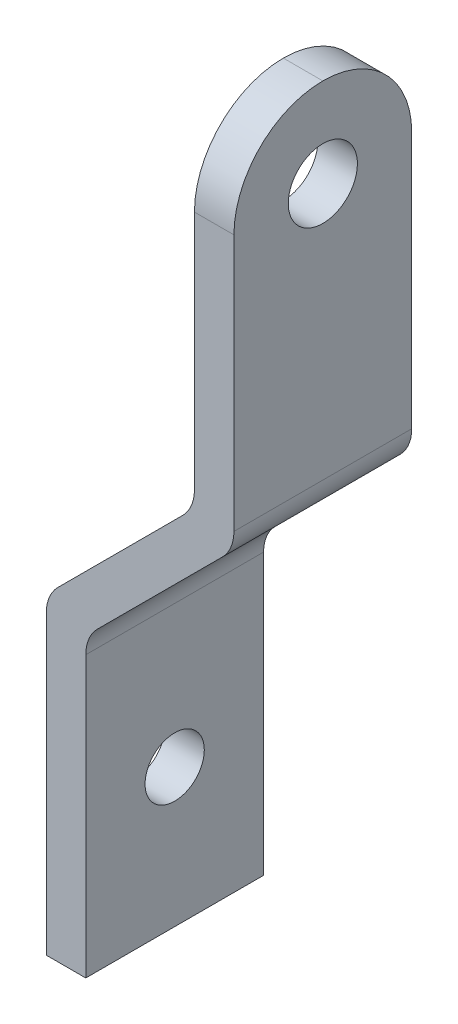
ISO-10303-21;
HEADER;
FILE_DESCRIPTION(('STEP AP214'),'2;1');
FILE_NAME('part.step','',(''),(''),'','','');
FILE_SCHEMA(('AUTOMOTIVE_DESIGN { 1 0 10303 214 1 1 1 1 }'));
ENDSEC;
DATA;
#1=APPLICATION_CONTEXT('core data for automotive mechanical design processes');
#2=APPLICATION_PROTOCOL_DEFINITION('international standard','automotive_design',2000,#1);
#3=PRODUCT_CONTEXT('',#1,'mechanical');
#4=PRODUCT('Part','Part','',(#3));
#5=PRODUCT_RELATED_PRODUCT_CATEGORY('part','',(#4));
#6=PRODUCT_DEFINITION_FORMATION('','',#4);
#7=PRODUCT_DEFINITION_CONTEXT('part definition',#1,'design');
#8=PRODUCT_DEFINITION('design','',#6,#7);
#9=PRODUCT_DEFINITION_SHAPE('','',#8);
#10=(LENGTH_UNIT() NAMED_UNIT(*) SI_UNIT(.MILLI.,.METRE.));
#11=(NAMED_UNIT(*) PLANE_ANGLE_UNIT() SI_UNIT($,.RADIAN.));
#12=(NAMED_UNIT(*) SI_UNIT($,.STERADIAN.) SOLID_ANGLE_UNIT());
#13=UNCERTAINTY_MEASURE_WITH_UNIT(LENGTH_MEASURE(1.E-05),#10,'distance_accuracy_value','');
#14=(GEOMETRIC_REPRESENTATION_CONTEXT(3) GLOBAL_UNCERTAINTY_ASSIGNED_CONTEXT((#13)) GLOBAL_UNIT_ASSIGNED_CONTEXT((#10,
#11,#12)) REPRESENTATION_CONTEXT('',''));
#15=CARTESIAN_POINT('',(0.,0.,0.));
#16=DIRECTION('',(0.,0.,1.));
#17=DIRECTION('',(1.,0.,0.));
#18=AXIS2_PLACEMENT_3D('',#15,#16,#17);
#19=CARTESIAN_POINT('',(0.,0.,11.43));
#20=DIRECTION('',(0.,1.,0.));
#21=DIRECTION('',(-1.,0.,0.));
#22=AXIS2_PLACEMENT_3D('',#19,#20,#21);
#23=PLANE('',#22);
#24=DIRECTION('',(1.,0.,0.));
#25=VECTOR('',#24,1.);
#26=CARTESIAN_POINT('',(0.,0.,0.));
#27=LINE('',#26,#25);
#28=CARTESIAN_POINT('',(0.,0.,0.));
#29=VERTEX_POINT('',#28);
#30=CARTESIAN_POINT('',(2.54,0.,0.));
#31=VERTEX_POINT('',#30);
#32=EDGE_CURVE('E161',#29,#31,#27,.T.);
#33=ORIENTED_EDGE('',*,*,#32,.T.);
#34=DIRECTION('',(0.,0.,-1.));
#35=VECTOR('',#34,1.);
#36=CARTESIAN_POINT('',(2.54,0.,11.43));
#37=LINE('',#36,#35);
#38=CARTESIAN_POINT('',(2.54,0.,11.43));
#39=VERTEX_POINT('',#38);
#40=EDGE_CURVE('E141',#39,#31,#37,.T.);
#41=ORIENTED_EDGE('',*,*,#40,.F.);
#42=DIRECTION('',(1.,0.,0.));
#43=VECTOR('',#42,1.);
#44=CARTESIAN_POINT('',(0.,0.,11.43));
#45=LINE('',#44,#43);
#46=CARTESIAN_POINT('',(0.,0.,11.43));
#47=VERTEX_POINT('',#46);
#48=EDGE_CURVE('E148',#47,#39,#45,.T.);
#49=ORIENTED_EDGE('',*,*,#48,.F.);
#50=DIRECTION('',(0.,0.,-1.));
#51=VECTOR('',#50,1.);
#52=CARTESIAN_POINT('',(0.,0.,11.43));
#53=LINE('',#52,#51);
#54=EDGE_CURVE('E164',#47,#29,#53,.T.);
#55=ORIENTED_EDGE('',*,*,#54,.T.);
#56=EDGE_LOOP('',(#33,#41,#49,#55));
#57=FACE_BOUND('',#56,.T.);
#58=ADVANCED_FACE('F39',(#57),#23,.F.);
#59=CARTESIAN_POINT('',(2.54,19.05,11.43));
#60=DIRECTION('',(-1.,0.,0.));
#61=DIRECTION('',(0.,-1.,0.));
#62=AXIS2_PLACEMENT_3D('',#59,#60,#61);
#63=PLANE('',#62);
#64=CARTESIAN_POINT('',(2.54,8.89,5.715));
#65=DIRECTION('',(-1.,0.,0.));
#66=DIRECTION('',(0.,-1.,0.));
#67=AXIS2_PLACEMENT_3D('',#64,#65,#66);
#68=CIRCLE('',#67,1.905);
#69=CARTESIAN_POINT('',(2.54,6.985,5.715));
#70=VERTEX_POINT('',#69);
#71=EDGE_CURVE('E199',#70,#70,#68,.T.);
#72=ORIENTED_EDGE('',*,*,#71,.T.);
#73=EDGE_LOOP('',(#72));
#74=FACE_BOUND('',#73,.T.);
#75=DIRECTION('',(0.,1.,0.));
#76=VECTOR('',#75,1.);
#77=CARTESIAN_POINT('',(2.54,19.05,0.));
#78=LINE('',#77,#76);
#79=CARTESIAN_POINT('',(2.54,17.9978975515723,0.));
#80=VERTEX_POINT('',#79);
#81=EDGE_CURVE('E284',#31,#80,#78,.T.);
#82=ORIENTED_EDGE('',*,*,#81,.T.);
#83=DIRECTION('',(0.,0.,-1.));
#84=VECTOR('',#83,1.);
#85=CARTESIAN_POINT('',(2.54,17.9978975515723,11.43));
#86=LINE('',#85,#84);
#87=CARTESIAN_POINT('',(2.54,17.9978975515723,11.43));
#88=VERTEX_POINT('',#87);
#89=EDGE_CURVE('E144',#80,#88,#86,.F.);
#90=ORIENTED_EDGE('',*,*,#89,.T.);
#91=DIRECTION('',(0.,1.,0.));
#92=VECTOR('',#91,1.);
#93=CARTESIAN_POINT('',(2.54,19.05,11.43));
#94=LINE('',#93,#92);
#95=EDGE_CURVE('E136',#39,#88,#94,.T.);
#96=ORIENTED_EDGE('',*,*,#95,.F.);
#97=ORIENTED_EDGE('',*,*,#40,.T.);
#98=EDGE_LOOP('',(#82,#90,#96,#97));
#99=FACE_BOUND('',#98,.T.);
#100=ADVANCED_FACE('F139',(#74,#99),#63,.F.);
#101=CARTESIAN_POINT('',(12.065,28.575,11.43));
#102=DIRECTION('',(-0.707106781186546,0.707106781186549,0.));
#103=DIRECTION('',(-0.707106781186549,-0.707106781186546,0.));
#104=AXIS2_PLACEMENT_3D('',#101,#102,#103);
#105=PLANE('',#104);
#106=DIRECTION('',(0.707106781186549,0.707106781186546,0.));
#107=VECTOR('',#106,1.);
#108=CARTESIAN_POINT('',(12.065,28.575,11.43));
#109=LINE('',#108,#107);
#110=CARTESIAN_POINT('',(3.28394877578617,19.7939487757862,11.43));
#111=VERTEX_POINT('',#110);
#112=CARTESIAN_POINT('',(11.3210512242138,27.8310512242138,11.43));
#113=VERTEX_POINT('',#112);
#114=EDGE_CURVE('E147',#111,#113,#109,.T.);
#115=ORIENTED_EDGE('',*,*,#114,.F.);
#116=DIRECTION('',(0.,0.,-1.));
#117=VECTOR('',#116,1.);
#118=CARTESIAN_POINT('',(3.28394877578617,19.7939487757862,0.));
#119=LINE('',#118,#117);
#120=CARTESIAN_POINT('',(3.28394877578617,19.7939487757862,0.));
#121=VERTEX_POINT('',#120);
#122=EDGE_CURVE('E206',#111,#121,#119,.T.);
#123=ORIENTED_EDGE('',*,*,#122,.T.);
#124=DIRECTION('',(0.707106781186549,0.707106781186546,0.));
#125=VECTOR('',#124,1.);
#126=CARTESIAN_POINT('',(12.065,28.575,0.));
#127=LINE('',#126,#125);
#128=CARTESIAN_POINT('',(11.3210512242138,27.8310512242138,0.));
#129=VERTEX_POINT('',#128);
#130=EDGE_CURVE('E287',#121,#129,#127,.T.);
#131=ORIENTED_EDGE('',*,*,#130,.T.);
#132=DIRECTION('',(0.,0.,-1.));
#133=VECTOR('',#132,1.);
#134=CARTESIAN_POINT('',(11.3210512242138,27.8310512242138,11.43));
#135=LINE('',#134,#133);
#136=EDGE_CURVE('E189',#129,#113,#135,.F.);
#137=ORIENTED_EDGE('',*,*,#136,.T.);
#138=EDGE_LOOP('',(#115,#123,#131,#137));
#139=FACE_BOUND('',#138,.T.);
#140=ADVANCED_FACE('F305',(#139),#105,.F.);
#141=CARTESIAN_POINT('',(12.065,51.8521024484276,11.43));
#142=DIRECTION('',(-1.,0.,0.));
#143=DIRECTION('',(0.,-1.,0.));
#144=AXIS2_PLACEMENT_3D('',#141,#142,#143);
#145=PLANE('',#144);
#146=CARTESIAN_POINT('',(12.065,46.1371024484276,5.715));
#147=DIRECTION('',(1.,0.,0.));
#148=DIRECTION('',(0.,1.,0.));
#149=AXIS2_PLACEMENT_3D('',#146,#147,#148);
#150=CIRCLE('',#149,2.2225);
#151=CARTESIAN_POINT('',(12.065,48.3596024484276,5.715));
#152=VERTEX_POINT('',#151);
#153=EDGE_CURVE('E200',#152,#152,#150,.T.);
#154=ORIENTED_EDGE('',*,*,#153,.F.);
#155=EDGE_LOOP('',(#154));
#156=FACE_BOUND('',#155,.T.);
#157=DIRECTION('',(0.,1.,0.));
#158=VECTOR('',#157,1.);
#159=CARTESIAN_POINT('',(12.065,51.8521024484276,11.43));
#160=LINE('',#159,#158);
#161=CARTESIAN_POINT('',(12.065,29.6271024484276,11.43));
#162=VERTEX_POINT('',#161);
#163=CARTESIAN_POINT('',(12.065,46.1371024484276,11.43));
#164=VERTEX_POINT('',#163);
#165=EDGE_CURVE('E278',#162,#164,#160,.T.);
#166=ORIENTED_EDGE('',*,*,#165,.F.);
#167=DIRECTION('',(0.,0.,-1.));
#168=VECTOR('',#167,1.);
#169=CARTESIAN_POINT('',(12.065,29.6271024484276,11.43));
#170=LINE('',#169,#168);
#171=CARTESIAN_POINT('',(12.065,29.6271024484276,0.));
#172=VERTEX_POINT('',#171);
#173=EDGE_CURVE('E222',#162,#172,#170,.T.);
#174=ORIENTED_EDGE('',*,*,#173,.T.);
#175=DIRECTION('',(0.,1.,0.));
#176=VECTOR('',#175,1.);
#177=CARTESIAN_POINT('',(12.065,51.8521024484276,0.));
#178=LINE('',#177,#176);
#179=CARTESIAN_POINT('',(12.065,46.1371024484276,0.));
#180=VERTEX_POINT('',#179);
#181=EDGE_CURVE('E264',#172,#180,#178,.T.);
#182=ORIENTED_EDGE('',*,*,#181,.T.);
#183=CARTESIAN_POINT('',(12.065,46.1371024484276,5.715));
#184=DIRECTION('',(-1.,0.,0.));
#185=DIRECTION('',(0.,-1.,0.));
#186=AXIS2_PLACEMENT_3D('',#183,#184,#185);
#187=CIRCLE('',#186,5.715);
#188=CARTESIAN_POINT('',(12.065,51.8521024484276,5.715));
#189=VERTEX_POINT('',#188);
#190=EDGE_CURVE('E183',#180,#189,#187,.F.);
#191=ORIENTED_EDGE('',*,*,#190,.T.);
#192=CARTESIAN_POINT('',(12.065,46.1371024484276,5.715));
#193=DIRECTION('',(-1.,0.,0.));
#194=DIRECTION('',(0.,-1.,0.));
#195=AXIS2_PLACEMENT_3D('',#192,#193,#194);
#196=CIRCLE('',#195,5.715);
#197=EDGE_CURVE('E179',#189,#164,#196,.F.);
#198=ORIENTED_EDGE('',*,*,#197,.T.);
#199=EDGE_LOOP('',(#166,#174,#182,#191,#198));
#200=FACE_BOUND('',#199,.T.);
#201=ADVANCED_FACE('F321',(#156,#200),#145,.F.);
#202=CARTESIAN_POINT('',(9.525,29.6271024484276,11.43));
#203=DIRECTION('',(1.,0.,0.));
#204=DIRECTION('',(0.,0.,-1.));
#205=AXIS2_PLACEMENT_3D('',#202,#203,#204);
#206=PLANE('',#205);
#207=CARTESIAN_POINT('',(9.525,46.1371024484276,5.715));
#208=DIRECTION('',(1.,0.,0.));
#209=DIRECTION('',(0.,0.,-1.));
#210=AXIS2_PLACEMENT_3D('',#207,#208,#209);
#211=CIRCLE('',#210,2.2225);
#212=CARTESIAN_POINT('',(9.525,46.1371024484276,3.4925));
#213=VERTEX_POINT('',#212);
#214=EDGE_CURVE('E194',#213,#213,#211,.T.);
#215=ORIENTED_EDGE('',*,*,#214,.T.);
#216=EDGE_LOOP('',(#215));
#217=FACE_BOUND('',#216,.T.);
#218=DIRECTION('',(0.,-1.,0.));
#219=VECTOR('',#218,1.);
#220=CARTESIAN_POINT('',(9.525,29.6271024484276,0.));
#221=LINE('',#220,#219);
#222=CARTESIAN_POINT('',(9.525,46.1371024484276,0.));
#223=VERTEX_POINT('',#222);
#224=CARTESIAN_POINT('',(9.525,30.6792048968553,0.));
#225=VERTEX_POINT('',#224);
#226=EDGE_CURVE('E251',#223,#225,#221,.T.);
#227=ORIENTED_EDGE('',*,*,#226,.T.);
#228=DIRECTION('',(0.,0.,-1.));
#229=VECTOR('',#228,1.);
#230=CARTESIAN_POINT('',(9.525,30.6792048968553,11.43));
#231=LINE('',#230,#229);
#232=CARTESIAN_POINT('',(9.525,30.6792048968553,11.43));
#233=VERTEX_POINT('',#232);
#234=EDGE_CURVE('E219',#225,#233,#231,.F.);
#235=ORIENTED_EDGE('',*,*,#234,.T.);
#236=DIRECTION('',(0.,-1.,0.));
#237=VECTOR('',#236,1.);
#238=CARTESIAN_POINT('',(9.525,29.6271024484276,11.43));
#239=LINE('',#238,#237);
#240=CARTESIAN_POINT('',(9.525,46.1371024484276,11.43));
#241=VERTEX_POINT('',#240);
#242=EDGE_CURVE('E270',#241,#233,#239,.T.);
#243=ORIENTED_EDGE('',*,*,#242,.F.);
#244=CARTESIAN_POINT('',(9.525,46.1371024484276,5.715));
#245=DIRECTION('',(1.,0.,0.));
#246=DIRECTION('',(0.,0.,-1.));
#247=AXIS2_PLACEMENT_3D('',#244,#245,#246);
#248=CIRCLE('',#247,5.715);
#249=CARTESIAN_POINT('',(9.525,51.8521024484276,5.715));
#250=VERTEX_POINT('',#249);
#251=EDGE_CURVE('E163',#241,#250,#248,.F.);
#252=ORIENTED_EDGE('',*,*,#251,.T.);
#253=CARTESIAN_POINT('',(9.525,46.1371024484276,5.715));
#254=DIRECTION('',(1.,0.,0.));
#255=DIRECTION('',(0.,0.,-1.));
#256=AXIS2_PLACEMENT_3D('',#253,#254,#255);
#257=CIRCLE('',#256,5.715);
#258=EDGE_CURVE('E168',#250,#223,#257,.F.);
#259=ORIENTED_EDGE('',*,*,#258,.T.);
#260=EDGE_LOOP('',(#227,#235,#243,#252,#259));
#261=FACE_BOUND('',#260,.T.);
#262=ADVANCED_FACE('F259',(#217,#261),#206,.F.);
#263=CARTESIAN_POINT('',(0.,20.1021024484277,11.43));
#264=DIRECTION('',(0.707106781186546,-0.707106781186549,0.));
#265=DIRECTION('',(0.707106781186549,0.707106781186546,0.));
#266=AXIS2_PLACEMENT_3D('',#263,#264,#265);
#267=PLANE('',#266);
#268=DIRECTION('',(-0.707106781186549,-0.707106781186546,0.));
#269=VECTOR('',#268,1.);
#270=CARTESIAN_POINT('',(0.,20.1021024484277,11.43));
#271=LINE('',#270,#269);
#272=CARTESIAN_POINT('',(8.78105122421383,28.8831536726415,11.43));
#273=VERTEX_POINT('',#272);
#274=CARTESIAN_POINT('',(0.743948775786171,20.8460512242138,11.43));
#275=VERTEX_POINT('',#274);
#276=EDGE_CURVE('E269',#273,#275,#271,.T.);
#277=ORIENTED_EDGE('',*,*,#276,.F.);
#278=DIRECTION('',(0.,0.,-1.));
#279=VECTOR('',#278,1.);
#280=CARTESIAN_POINT('',(8.78105122421383,28.8831536726415,0.));
#281=LINE('',#280,#279);
#282=CARTESIAN_POINT('',(8.78105122421383,28.8831536726415,0.));
#283=VERTEX_POINT('',#282);
#284=EDGE_CURVE('E215',#273,#283,#281,.T.);
#285=ORIENTED_EDGE('',*,*,#284,.T.);
#286=DIRECTION('',(-0.707106781186549,-0.707106781186546,0.));
#287=VECTOR('',#286,1.);
#288=CARTESIAN_POINT('',(0.,20.1021024484277,0.));
#289=LINE('',#288,#287);
#290=CARTESIAN_POINT('',(0.743948775786171,20.8460512242138,0.));
#291=VERTEX_POINT('',#290);
#292=EDGE_CURVE('E254',#283,#291,#289,.T.);
#293=ORIENTED_EDGE('',*,*,#292,.T.);
#294=DIRECTION('',(0.,0.,-1.));
#295=VECTOR('',#294,1.);
#296=CARTESIAN_POINT('',(0.743948775786171,20.8460512242138,11.43));
#297=LINE('',#296,#295);
#298=EDGE_CURVE('E212',#291,#275,#297,.F.);
#299=ORIENTED_EDGE('',*,*,#298,.T.);
#300=EDGE_LOOP('',(#277,#285,#293,#299));
#301=FACE_BOUND('',#300,.T.);
#302=ADVANCED_FACE('F272',(#301),#267,.F.);
#303=CARTESIAN_POINT('',(0.,0.,11.43));
#304=DIRECTION('',(1.,0.,0.));
#305=DIRECTION('',(0.,0.,-1.));
#306=AXIS2_PLACEMENT_3D('',#303,#304,#305);
#307=PLANE('',#306);
#308=CARTESIAN_POINT('',(0.,8.89,5.715));
#309=DIRECTION('',(1.,0.,0.));
#310=DIRECTION('',(0.,0.,-1.));
#311=AXIS2_PLACEMENT_3D('',#308,#309,#310);
#312=CIRCLE('',#311,1.905);
#313=CARTESIAN_POINT('',(0.,8.89,3.81));
#314=VERTEX_POINT('',#313);
#315=EDGE_CURVE('E195',#314,#314,#312,.T.);
#316=ORIENTED_EDGE('',*,*,#315,.T.);
#317=EDGE_LOOP('',(#316));
#318=FACE_BOUND('',#317,.T.);
#319=DIRECTION('',(0.,-1.,0.));
#320=VECTOR('',#319,1.);
#321=CARTESIAN_POINT('',(0.,0.,11.43));
#322=LINE('',#321,#320);
#323=CARTESIAN_POINT('',(0.,19.05,11.43));
#324=VERTEX_POINT('',#323);
#325=EDGE_CURVE('E153',#324,#47,#322,.T.);
#326=ORIENTED_EDGE('',*,*,#325,.F.);
#327=DIRECTION('',(0.,0.,-1.));
#328=VECTOR('',#327,1.);
#329=CARTESIAN_POINT('',(0.,19.05,11.43));
#330=LINE('',#329,#328);
#331=CARTESIAN_POINT('',(0.,19.05,0.));
#332=VERTEX_POINT('',#331);
#333=EDGE_CURVE('E236',#324,#332,#330,.T.);
#334=ORIENTED_EDGE('',*,*,#333,.T.);
#335=DIRECTION('',(0.,-1.,0.));
#336=VECTOR('',#335,1.);
#337=CARTESIAN_POINT('',(0.,0.,0.));
#338=LINE('',#337,#336);
#339=EDGE_CURVE('E158',#332,#29,#338,.T.);
#340=ORIENTED_EDGE('',*,*,#339,.T.);
#341=ORIENTED_EDGE('',*,*,#54,.F.);
#342=EDGE_LOOP('',(#326,#334,#340,#341));
#343=FACE_BOUND('',#342,.T.);
#344=ADVANCED_FACE('F297',(#318,#343),#307,.F.);
#345=CARTESIAN_POINT('',(0.,0.,11.43));
#346=DIRECTION('',(0.,0.,-1.));
#347=DIRECTION('',(-1.,0.,0.));
#348=AXIS2_PLACEMENT_3D('',#345,#346,#347);
#349=PLANE('',#348);
#350=ORIENTED_EDGE('',*,*,#114,.T.);
#351=CARTESIAN_POINT('',(9.525,29.6271024484276,11.43));
#352=DIRECTION('',(0.,0.,-1.));
#353=DIRECTION('',(-1.,0.,0.));
#354=AXIS2_PLACEMENT_3D('',#351,#352,#353);
#355=CIRCLE('',#354,2.54);
#356=EDGE_CURVE('E233',#113,#162,#355,.F.);
#357=ORIENTED_EDGE('',*,*,#356,.T.);
#358=ORIENTED_EDGE('',*,*,#165,.T.);
#359=DIRECTION('',(-1.,0.,0.));
#360=VECTOR('',#359,1.);
#361=CARTESIAN_POINT('',(0.,46.1371024484276,11.43));
#362=LINE('',#361,#360);
#363=EDGE_CURVE('E186',#164,#241,#362,.T.);
#364=ORIENTED_EDGE('',*,*,#363,.T.);
#365=ORIENTED_EDGE('',*,*,#242,.T.);
#366=CARTESIAN_POINT('',(6.985,30.6792048968553,11.43));
#367=DIRECTION('',(0.,0.,-1.));
#368=DIRECTION('',(-1.,0.,0.));
#369=AXIS2_PLACEMENT_3D('',#366,#367,#368);
#370=CIRCLE('',#369,2.54);
#371=EDGE_CURVE('E11',#233,#273,#370,.T.);
#372=ORIENTED_EDGE('',*,*,#371,.T.);
#373=ORIENTED_EDGE('',*,*,#276,.T.);
#374=CARTESIAN_POINT('',(2.54,19.05,11.43));
#375=DIRECTION('',(0.,0.,-1.));
#376=DIRECTION('',(-1.,0.,0.));
#377=AXIS2_PLACEMENT_3D('',#374,#375,#376);
#378=CIRCLE('',#377,2.54);
#379=EDGE_CURVE('E55',#275,#324,#378,.F.);
#380=ORIENTED_EDGE('',*,*,#379,.T.);
#381=ORIENTED_EDGE('',*,*,#325,.T.);
#382=ORIENTED_EDGE('',*,*,#48,.T.);
#383=ORIENTED_EDGE('',*,*,#95,.T.);
#384=CARTESIAN_POINT('',(5.08,17.9978975515723,11.43));
#385=DIRECTION('',(0.,0.,-1.));
#386=DIRECTION('',(-1.,0.,0.));
#387=AXIS2_PLACEMENT_3D('',#384,#385,#386);
#388=CIRCLE('',#387,2.54);
#389=EDGE_CURVE('E242',#88,#111,#388,.T.);
#390=ORIENTED_EDGE('',*,*,#389,.T.);
#391=EDGE_LOOP('',(#350,#357,#358,#364,#365,#372,#373,#380,#381,#382,#383,#390));
#392=FACE_BOUND('',#391,.T.);
#393=ADVANCED_FACE('F152',(#392),#349,.F.);
#394=CARTESIAN_POINT('',(0.,0.,0.));
#395=DIRECTION('',(0.,0.,-1.));
#396=DIRECTION('',(-1.,0.,0.));
#397=AXIS2_PLACEMENT_3D('',#394,#395,#396);
#398=PLANE('',#397);
#399=ORIENTED_EDGE('',*,*,#181,.F.);
#400=CARTESIAN_POINT('',(9.525,29.6271024484276,0.));
#401=DIRECTION('',(0.,0.,-1.));
#402=DIRECTION('',(-1.,0.,0.));
#403=AXIS2_PLACEMENT_3D('',#400,#401,#402);
#404=CIRCLE('',#403,2.54);
#405=EDGE_CURVE('E228',#172,#129,#404,.T.);
#406=ORIENTED_EDGE('',*,*,#405,.T.);
#407=ORIENTED_EDGE('',*,*,#130,.F.);
#408=CARTESIAN_POINT('',(5.08,17.9978975515723,0.));
#409=DIRECTION('',(0.,0.,-1.));
#410=DIRECTION('',(-1.,0.,0.));
#411=AXIS2_PLACEMENT_3D('',#408,#409,#410);
#412=CIRCLE('',#411,2.54);
#413=EDGE_CURVE('E239',#121,#80,#412,.F.);
#414=ORIENTED_EDGE('',*,*,#413,.T.);
#415=ORIENTED_EDGE('',*,*,#81,.F.);
#416=ORIENTED_EDGE('',*,*,#32,.F.);
#417=ORIENTED_EDGE('',*,*,#339,.F.);
#418=CARTESIAN_POINT('',(2.54,19.05,0.));
#419=DIRECTION('',(0.,0.,-1.));
#420=DIRECTION('',(-1.,0.,0.));
#421=AXIS2_PLACEMENT_3D('',#418,#419,#420);
#422=CIRCLE('',#421,2.54);
#423=EDGE_CURVE('E63',#332,#291,#422,.T.);
#424=ORIENTED_EDGE('',*,*,#423,.T.);
#425=ORIENTED_EDGE('',*,*,#292,.F.);
#426=CARTESIAN_POINT('',(6.985,30.6792048968553,0.));
#427=DIRECTION('',(0.,0.,-1.));
#428=DIRECTION('',(-1.,0.,0.));
#429=AXIS2_PLACEMENT_3D('',#426,#427,#428);
#430=CIRCLE('',#429,2.54);
#431=EDGE_CURVE('E48',#283,#225,#430,.F.);
#432=ORIENTED_EDGE('',*,*,#431,.T.);
#433=ORIENTED_EDGE('',*,*,#226,.F.);
#434=DIRECTION('',(-1.,0.,0.));
#435=VECTOR('',#434,1.);
#436=CARTESIAN_POINT('',(12.065,46.1371024484276,0.));
#437=LINE('',#436,#435);
#438=EDGE_CURVE('E175',#223,#180,#437,.F.);
#439=ORIENTED_EDGE('',*,*,#438,.T.);
#440=EDGE_LOOP('',(#399,#406,#407,#414,#415,#416,#417,#424,#425,#432,#433,#439));
#441=FACE_BOUND('',#440,.T.);
#442=ADVANCED_FACE('F250',(#441),#398,.T.);
#443=CARTESIAN_POINT('',(0.,46.1371024484276,5.715));
#444=DIRECTION('',(-1.,0.,0.));
#445=DIRECTION('',(0.,0.,1.));
#446=AXIS2_PLACEMENT_3D('',#443,#444,#445);
#447=CYLINDRICAL_SURFACE('',#446,5.715);
#448=ORIENTED_EDGE('',*,*,#363,.F.);
#449=ORIENTED_EDGE('',*,*,#197,.F.);
#450=DIRECTION('',(-1.,0.,0.));
#451=VECTOR('',#450,1.);
#452=CARTESIAN_POINT('',(9.525,51.8521024484276,5.715));
#453=LINE('',#452,#451);
#454=EDGE_CURVE('E190',#250,#189,#453,.F.);
#455=ORIENTED_EDGE('',*,*,#454,.F.);
#456=ORIENTED_EDGE('',*,*,#251,.F.);
#457=EDGE_LOOP('',(#448,#449,#455,#456));
#458=FACE_BOUND('',#457,.T.);
#459=ADVANCED_FACE('F337',(#458),#447,.T.);
#460=CARTESIAN_POINT('',(9.525,46.1371024484276,5.715));
#461=DIRECTION('',(1.,0.,0.));
#462=DIRECTION('',(0.,0.,-1.));
#463=AXIS2_PLACEMENT_3D('',#460,#461,#462);
#464=CYLINDRICAL_SURFACE('',#463,5.715);
#465=ORIENTED_EDGE('',*,*,#190,.F.);
#466=ORIENTED_EDGE('',*,*,#438,.F.);
#467=ORIENTED_EDGE('',*,*,#258,.F.);
#468=ORIENTED_EDGE('',*,*,#454,.T.);
#469=EDGE_LOOP('',(#465,#466,#467,#468));
#470=FACE_BOUND('',#469,.T.);
#471=ADVANCED_FACE('F333',(#470),#464,.T.);
#472=CARTESIAN_POINT('',(-0.634999999999993,8.89,5.715));
#473=DIRECTION('',(1.,0.,0.));
#474=DIRECTION('',(0.,1.,0.));
#475=AXIS2_PLACEMENT_3D('',#472,#473,#474);
#476=CYLINDRICAL_SURFACE('',#475,1.905);
#477=ORIENTED_EDGE('',*,*,#315,.F.);
#478=EDGE_LOOP('',(#477));
#479=FACE_BOUND('',#478,.T.);
#480=ORIENTED_EDGE('',*,*,#71,.F.);
#481=EDGE_LOOP('',(#480));
#482=FACE_BOUND('',#481,.T.);
#483=ADVANCED_FACE('F344',(#479,#482),#476,.F.);
#484=CARTESIAN_POINT('',(-0.634999999999998,46.1371024484276,5.715));
#485=DIRECTION('',(1.,0.,0.));
#486=DIRECTION('',(0.,1.,0.));
#487=AXIS2_PLACEMENT_3D('',#484,#485,#486);
#488=CYLINDRICAL_SURFACE('',#487,2.2225);
#489=ORIENTED_EDGE('',*,*,#153,.T.);
#490=EDGE_LOOP('',(#489));
#491=FACE_BOUND('',#490,.T.);
#492=ORIENTED_EDGE('',*,*,#214,.F.);
#493=EDGE_LOOP('',(#492));
#494=FACE_BOUND('',#493,.T.);
#495=ADVANCED_FACE('F318',(#491,#494),#488,.F.);
#496=CARTESIAN_POINT('',(5.08,17.9978975515723,11.43));
#497=DIRECTION('',(0.,0.,1.));
#498=DIRECTION('',(1.,0.,0.));
#499=AXIS2_PLACEMENT_3D('',#496,#497,#498);
#500=CYLINDRICAL_SURFACE('',#499,2.54);
#501=ORIENTED_EDGE('',*,*,#389,.F.);
#502=ORIENTED_EDGE('',*,*,#89,.F.);
#503=ORIENTED_EDGE('',*,*,#413,.F.);
#504=ORIENTED_EDGE('',*,*,#122,.F.);
#505=EDGE_LOOP('',(#501,#502,#503,#504));
#506=FACE_BOUND('',#505,.T.);
#507=ADVANCED_FACE('F300',(#506),#500,.F.);
#508=CARTESIAN_POINT('',(6.985,30.6792048968553,11.43));
#509=DIRECTION('',(0.,0.,1.));
#510=DIRECTION('',(1.,0.,0.));
#511=AXIS2_PLACEMENT_3D('',#508,#509,#510);
#512=CYLINDRICAL_SURFACE('',#511,2.54);
#513=ORIENTED_EDGE('',*,*,#371,.F.);
#514=ORIENTED_EDGE('',*,*,#234,.F.);
#515=ORIENTED_EDGE('',*,*,#431,.F.);
#516=ORIENTED_EDGE('',*,*,#284,.F.);
#517=EDGE_LOOP('',(#513,#514,#515,#516));
#518=FACE_BOUND('',#517,.T.);
#519=ADVANCED_FACE('F267',(#518),#512,.F.);
#520=CARTESIAN_POINT('',(9.525,29.6271024484276,11.43));
#521=DIRECTION('',(0.,0.,-1.));
#522=DIRECTION('',(-1.,0.,0.));
#523=AXIS2_PLACEMENT_3D('',#520,#521,#522);
#524=CYLINDRICAL_SURFACE('',#523,2.54);
#525=ORIENTED_EDGE('',*,*,#356,.F.);
#526=ORIENTED_EDGE('',*,*,#136,.F.);
#527=ORIENTED_EDGE('',*,*,#405,.F.);
#528=ORIENTED_EDGE('',*,*,#173,.F.);
#529=EDGE_LOOP('',(#525,#526,#527,#528));
#530=FACE_BOUND('',#529,.T.);
#531=ADVANCED_FACE('F330',(#530),#524,.T.);
#532=CARTESIAN_POINT('',(2.54,19.05,11.43));
#533=DIRECTION('',(0.,0.,-1.));
#534=DIRECTION('',(-1.,0.,0.));
#535=AXIS2_PLACEMENT_3D('',#532,#533,#534);
#536=CYLINDRICAL_SURFACE('',#535,2.54);
#537=ORIENTED_EDGE('',*,*,#379,.F.);
#538=ORIENTED_EDGE('',*,*,#298,.F.);
#539=ORIENTED_EDGE('',*,*,#423,.F.);
#540=ORIENTED_EDGE('',*,*,#333,.F.);
#541=EDGE_LOOP('',(#537,#538,#539,#540));
#542=FACE_BOUND('',#541,.T.);
#543=ADVANCED_FACE('F41',(#542),#536,.T.);
#544=CLOSED_SHELL('',(#58,#100,#140,#201,#262,#302,#344,#393,#442,#459,#471,#483,#495,#507,#519,
#531,#543));
#545=MANIFOLD_SOLID_BREP('B2',#544);
#546=ADVANCED_BREP_SHAPE_REPRESENTATION('',(#18,#545),#14);
#547=SHAPE_DEFINITION_REPRESENTATION(#9,#546);
ENDSEC;
END-ISO-10303-21;
